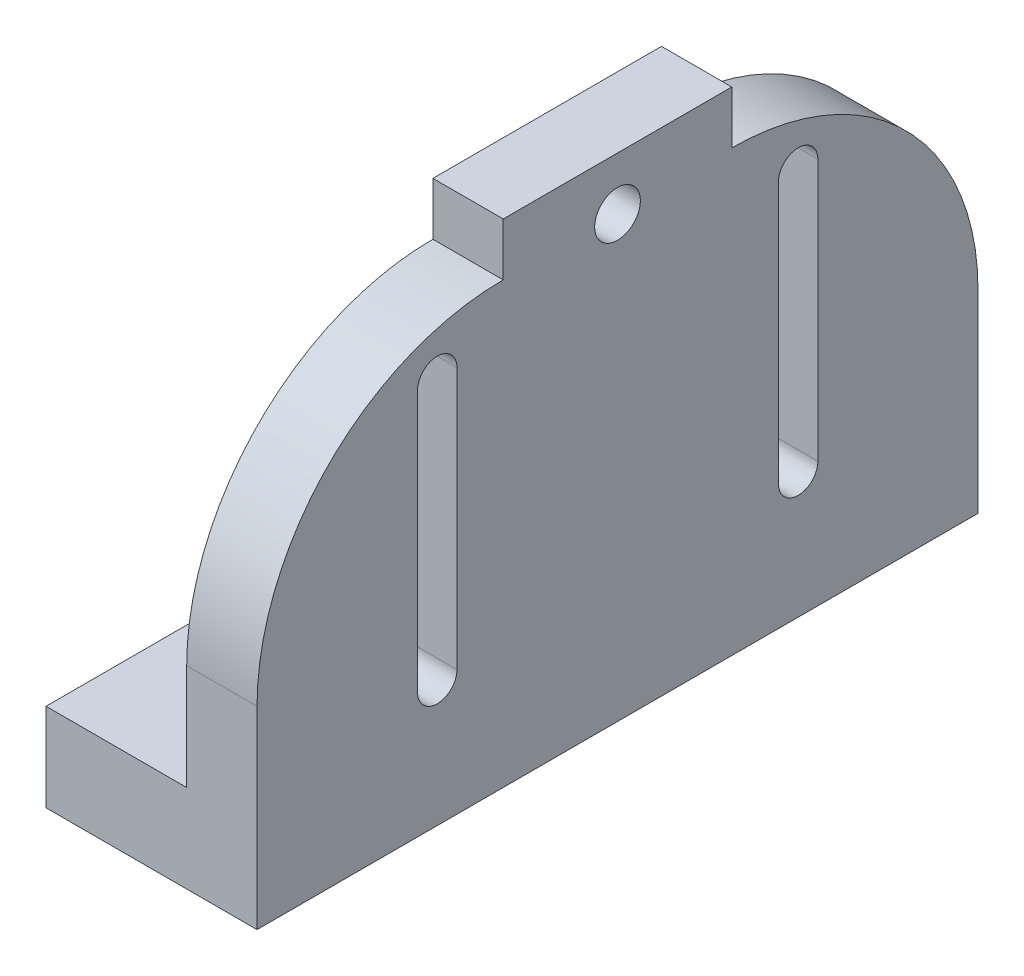
ISO-10303-21;
HEADER;
FILE_DESCRIPTION(('STEP AP214'),'2;1');
FILE_NAME('part.step','',(''),(''),'','','');
FILE_SCHEMA(('AUTOMOTIVE_DESIGN { 1 0 10303 214 1 1 1 1 }'));
ENDSEC;
DATA;
#1=APPLICATION_CONTEXT('core data for automotive mechanical design processes');
#2=APPLICATION_PROTOCOL_DEFINITION('international standard','automotive_design',2000,#1);
#3=PRODUCT_CONTEXT('',#1,'mechanical');
#4=PRODUCT('Part','Part','',(#3));
#5=PRODUCT_RELATED_PRODUCT_CATEGORY('part','',(#4));
#6=PRODUCT_DEFINITION_FORMATION('','',#4);
#7=PRODUCT_DEFINITION_CONTEXT('part definition',#1,'design');
#8=PRODUCT_DEFINITION('design','',#6,#7);
#9=PRODUCT_DEFINITION_SHAPE('','',#8);
#10=(LENGTH_UNIT() NAMED_UNIT(*) SI_UNIT(.MILLI.,.METRE.));
#11=(NAMED_UNIT(*) PLANE_ANGLE_UNIT() SI_UNIT($,.RADIAN.));
#12=(NAMED_UNIT(*) SI_UNIT($,.STERADIAN.) SOLID_ANGLE_UNIT());
#13=UNCERTAINTY_MEASURE_WITH_UNIT(LENGTH_MEASURE(1.E-05),#10,'distance_accuracy_value','');
#14=(GEOMETRIC_REPRESENTATION_CONTEXT(3) GLOBAL_UNCERTAINTY_ASSIGNED_CONTEXT((#13)) GLOBAL_UNIT_ASSIGNED_CONTEXT((#10,
#11,#12)) REPRESENTATION_CONTEXT('',''));
#15=CARTESIAN_POINT('',(0.,0.,0.));
#16=DIRECTION('',(0.,0.,1.));
#17=DIRECTION('',(1.,0.,0.));
#18=AXIS2_PLACEMENT_3D('',#15,#16,#17);
#19=CARTESIAN_POINT('',(0.,6.35,0.));
#20=DIRECTION('',(0.,-1.,0.));
#21=DIRECTION('',(0.,0.,-1.));
#22=AXIS2_PLACEMENT_3D('',#19,#20,#21);
#23=PLANE('',#22);
#24=CARTESIAN_POINT('',(5.08,6.35,-38.735));
#25=DIRECTION('',(0.,1.,0.));
#26=DIRECTION('',(0.,0.,1.));
#27=AXIS2_PLACEMENT_3D('',#24,#25,#26);
#28=CIRCLE('',#27,1.651);
#29=CARTESIAN_POINT('',(5.08,6.35,-37.084));
#30=VERTEX_POINT('',#29);
#31=EDGE_CURVE('E201',#30,#30,#28,.T.);
#32=ORIENTED_EDGE('',*,*,#31,.F.);
#33=EDGE_LOOP('',(#32));
#34=FACE_BOUND('',#33,.T.);
#35=CARTESIAN_POINT('',(5.08,6.35,-13.335));
#36=DIRECTION('',(0.,1.,0.));
#37=DIRECTION('',(0.,0.,1.));
#38=AXIS2_PLACEMENT_3D('',#35,#36,#37);
#39=CIRCLE('',#38,1.651);
#40=CARTESIAN_POINT('',(5.08,6.35,-11.684));
#41=VERTEX_POINT('',#40);
#42=EDGE_CURVE('E198',#41,#41,#39,.T.);
#43=ORIENTED_EDGE('',*,*,#42,.F.);
#44=EDGE_LOOP('',(#43));
#45=FACE_BOUND('',#44,.T.);
#46=DIRECTION('',(0.,0.,1.));
#47=VECTOR('',#46,1.);
#48=CARTESIAN_POINT('',(10.16,6.35,-52.07));
#49=LINE('',#48,#47);
#50=CARTESIAN_POINT('',(10.16,6.35,-52.07));
#51=VERTEX_POINT('',#50);
#52=CARTESIAN_POINT('',(10.16,6.35,0.));
#53=VERTEX_POINT('',#52);
#54=EDGE_CURVE('E225',#51,#53,#49,.T.);
#55=ORIENTED_EDGE('',*,*,#54,.F.);
#56=DIRECTION('',(-1.,0.,0.));
#57=VECTOR('',#56,1.);
#58=CARTESIAN_POINT('',(0.,6.35,-52.07));
#59=LINE('',#58,#57);
#60=CARTESIAN_POINT('',(0.,6.35,-52.07));
#61=VERTEX_POINT('',#60);
#62=EDGE_CURVE('E266',#51,#61,#59,.T.);
#63=ORIENTED_EDGE('',*,*,#62,.T.);
#64=DIRECTION('',(0.,0.,1.));
#65=VECTOR('',#64,1.);
#66=CARTESIAN_POINT('',(0.,6.35,0.));
#67=LINE('',#66,#65);
#68=CARTESIAN_POINT('',(0.,6.35,0.));
#69=VERTEX_POINT('',#68);
#70=EDGE_CURVE('E259',#61,#69,#67,.T.);
#71=ORIENTED_EDGE('',*,*,#70,.T.);
#72=DIRECTION('',(1.,0.,0.));
#73=VECTOR('',#72,1.);
#74=CARTESIAN_POINT('',(0.,6.35,0.));
#75=LINE('',#74,#73);
#76=EDGE_CURVE('E262',#69,#53,#75,.T.);
#77=ORIENTED_EDGE('',*,*,#76,.T.);
#78=EDGE_LOOP('',(#55,#63,#71,#77));
#79=FACE_BOUND('',#78,.T.);
#80=ADVANCED_FACE('F47',(#34,#45,#79),#23,.F.);
#81=CARTESIAN_POINT('',(0.,6.35,0.));
#82=DIRECTION('',(1.,0.,0.));
#83=DIRECTION('',(0.,0.,-1.));
#84=AXIS2_PLACEMENT_3D('',#81,#82,#83);
#85=PLANE('',#84);
#86=DIRECTION('',(0.,0.,1.));
#87=VECTOR('',#86,1.);
#88=CARTESIAN_POINT('',(0.,0.,0.));
#89=LINE('',#88,#87);
#90=CARTESIAN_POINT('',(0.,0.,-52.07));
#91=VERTEX_POINT('',#90);
#92=CARTESIAN_POINT('',(0.,0.,0.));
#93=VERTEX_POINT('',#92);
#94=EDGE_CURVE('E258',#91,#93,#89,.T.);
#95=ORIENTED_EDGE('',*,*,#94,.T.);
#96=DIRECTION('',(0.,-1.,0.));
#97=VECTOR('',#96,1.);
#98=CARTESIAN_POINT('',(0.,6.35,0.));
#99=LINE('',#98,#97);
#100=EDGE_CURVE('E284',#69,#93,#99,.T.);
#101=ORIENTED_EDGE('',*,*,#100,.F.);
#102=ORIENTED_EDGE('',*,*,#70,.F.);
#103=DIRECTION('',(0.,-1.,0.));
#104=VECTOR('',#103,1.);
#105=CARTESIAN_POINT('',(0.,6.35,-52.07));
#106=LINE('',#105,#104);
#107=EDGE_CURVE('E268',#61,#91,#106,.T.);
#108=ORIENTED_EDGE('',*,*,#107,.T.);
#109=EDGE_LOOP('',(#95,#101,#102,#108));
#110=FACE_BOUND('',#109,.T.);
#111=ADVANCED_FACE('F382',(#110),#85,.F.);
#112=CARTESIAN_POINT('',(0.,6.35,0.));
#113=DIRECTION('',(0.,0.,-1.));
#114=DIRECTION('',(-1.,0.,0.));
#115=AXIS2_PLACEMENT_3D('',#112,#113,#114);
#116=PLANE('',#115);
#117=DIRECTION('',(0.,-1.,0.));
#118=VECTOR('',#117,1.);
#119=CARTESIAN_POINT('',(15.24,6.35,0.));
#120=LINE('',#119,#118);
#121=CARTESIAN_POINT('',(15.24,13.97,0.));
#122=VERTEX_POINT('',#121);
#123=CARTESIAN_POINT('',(15.24,0.,0.));
#124=VERTEX_POINT('',#123);
#125=EDGE_CURVE('E282',#122,#124,#120,.T.);
#126=ORIENTED_EDGE('',*,*,#125,.F.);
#127=DIRECTION('',(1.,0.,0.));
#128=VECTOR('',#127,1.);
#129=CARTESIAN_POINT('',(0.,13.97,0.));
#130=LINE('',#129,#128);
#131=CARTESIAN_POINT('',(10.16,13.97,0.));
#132=VERTEX_POINT('',#131);
#133=EDGE_CURVE('E70',#122,#132,#130,.F.);
#134=ORIENTED_EDGE('',*,*,#133,.T.);
#135=DIRECTION('',(0.,-1.,0.));
#136=VECTOR('',#135,1.);
#137=CARTESIAN_POINT('',(10.16,31.75,0.));
#138=LINE('',#137,#136);
#139=EDGE_CURVE('E254',#132,#53,#138,.T.);
#140=ORIENTED_EDGE('',*,*,#139,.T.);
#141=ORIENTED_EDGE('',*,*,#76,.F.);
#142=ORIENTED_EDGE('',*,*,#100,.T.);
#143=DIRECTION('',(1.,0.,0.));
#144=VECTOR('',#143,1.);
#145=CARTESIAN_POINT('',(0.,0.,0.));
#146=LINE('',#145,#144);
#147=EDGE_CURVE('E271',#93,#124,#146,.T.);
#148=ORIENTED_EDGE('',*,*,#147,.T.);
#149=EDGE_LOOP('',(#126,#134,#140,#141,#142,#148));
#150=FACE_BOUND('',#149,.T.);
#151=ADVANCED_FACE('F390',(#150),#116,.F.);
#152=CARTESIAN_POINT('',(15.24,6.35,0.));
#153=DIRECTION('',(-1.,0.,0.));
#154=DIRECTION('',(0.,0.,1.));
#155=AXIS2_PLACEMENT_3D('',#152,#153,#154);
#156=PLANE('',#155);
#157=CARTESIAN_POINT('',(15.24,31.75,-26.035));
#158=DIRECTION('',(-1.,0.,0.));
#159=DIRECTION('',(0.,0.,1.));
#160=AXIS2_PLACEMENT_3D('',#157,#158,#159);
#161=CIRCLE('',#160,1.651);
#162=CARTESIAN_POINT('',(15.24,31.75,-24.384));
#163=VERTEX_POINT('',#162);
#164=EDGE_CURVE('E191',#163,#163,#161,.T.);
#165=ORIENTED_EDGE('',*,*,#164,.T.);
#166=EDGE_LOOP('',(#165));
#167=FACE_BOUND('',#166,.T.);
#168=DIRECTION('',(0.,-1.,0.));
#169=VECTOR('',#168,1.);
#170=CARTESIAN_POINT('',(15.24,27.94,-11.5951));
#171=LINE('',#170,#169);
#172=CARTESIAN_POINT('',(15.24,27.94,-11.5951));
#173=VERTEX_POINT('',#172);
#174=CARTESIAN_POINT('',(15.24,9.0424,-11.5951));
#175=VERTEX_POINT('',#174);
#176=EDGE_CURVE('E212',#173,#175,#171,.T.);
#177=ORIENTED_EDGE('',*,*,#176,.F.);
#178=CARTESIAN_POINT('',(15.24,27.94,-13.0175));
#179=DIRECTION('',(1.,0.,0.));
#180=DIRECTION('',(0.,0.,-1.));
#181=AXIS2_PLACEMENT_3D('',#178,#179,#180);
#182=CIRCLE('',#181,1.42239999999999);
#183=CARTESIAN_POINT('',(15.24,27.94,-14.4399));
#184=VERTEX_POINT('',#183);
#185=EDGE_CURVE('E210',#184,#173,#182,.T.);
#186=ORIENTED_EDGE('',*,*,#185,.F.);
#187=DIRECTION('',(0.,1.,0.));
#188=VECTOR('',#187,1.);
#189=CARTESIAN_POINT('',(15.24,27.94,-14.4399));
#190=LINE('',#189,#188);
#191=CARTESIAN_POINT('',(15.24,9.0424,-14.4399));
#192=VERTEX_POINT('',#191);
#193=EDGE_CURVE('E219',#192,#184,#190,.T.);
#194=ORIENTED_EDGE('',*,*,#193,.F.);
#195=CARTESIAN_POINT('',(15.24,9.0424,-13.0175));
#196=DIRECTION('',(1.,0.,0.));
#197=DIRECTION('',(0.,0.,-1.));
#198=AXIS2_PLACEMENT_3D('',#195,#196,#197);
#199=CIRCLE('',#198,1.4224);
#200=EDGE_CURVE('E216',#175,#192,#199,.T.);
#201=ORIENTED_EDGE('',*,*,#200,.F.);
#202=EDGE_LOOP('',(#177,#186,#194,#201));
#203=FACE_BOUND('',#202,.T.);
#204=DIRECTION('',(0.,-1.,0.));
#205=VECTOR('',#204,1.);
#206=CARTESIAN_POINT('',(15.24,27.94,-37.6604262696524));
#207=LINE('',#206,#205);
#208=CARTESIAN_POINT('',(15.24,27.94,-37.6604262696524));
#209=VERTEX_POINT('',#208);
#210=CARTESIAN_POINT('',(15.24,9.0424,-37.6604262696524));
#211=VERTEX_POINT('',#210);
#212=EDGE_CURVE('E248',#209,#211,#207,.T.);
#213=ORIENTED_EDGE('',*,*,#212,.F.);
#214=CARTESIAN_POINT('',(15.24,27.94,-39.0828262696524));
#215=DIRECTION('',(1.,0.,0.));
#216=DIRECTION('',(0.,0.,-1.));
#217=AXIS2_PLACEMENT_3D('',#214,#215,#216);
#218=CIRCLE('',#217,1.42239999999999);
#219=CARTESIAN_POINT('',(15.24,27.94,-40.5052262696524));
#220=VERTEX_POINT('',#219);
#221=EDGE_CURVE('E213',#220,#209,#218,.T.);
#222=ORIENTED_EDGE('',*,*,#221,.F.);
#223=DIRECTION('',(0.,1.,0.));
#224=VECTOR('',#223,1.);
#225=CARTESIAN_POINT('',(15.24,27.94,-40.5052262696524));
#226=LINE('',#225,#224);
#227=CARTESIAN_POINT('',(15.24,9.0424,-40.5052262696524));
#228=VERTEX_POINT('',#227);
#229=EDGE_CURVE('E235',#228,#220,#226,.T.);
#230=ORIENTED_EDGE('',*,*,#229,.F.);
#231=CARTESIAN_POINT('',(15.24,9.0424,-39.0828262696524));
#232=DIRECTION('',(1.,0.,0.));
#233=DIRECTION('',(0.,0.,-1.));
#234=AXIS2_PLACEMENT_3D('',#231,#232,#233);
#235=CIRCLE('',#234,1.42239999999999);
#236=EDGE_CURVE('E245',#211,#228,#235,.T.);
#237=ORIENTED_EDGE('',*,*,#236,.F.);
#238=EDGE_LOOP('',(#213,#222,#230,#237));
#239=FACE_BOUND('',#238,.T.);
#240=CARTESIAN_POINT('',(15.24,13.97,-34.29));
#241=DIRECTION('',(-1.,0.,0.));
#242=DIRECTION('',(0.,0.,1.));
#243=AXIS2_PLACEMENT_3D('',#240,#241,#242);
#244=CIRCLE('',#243,17.78);
#245=CARTESIAN_POINT('',(15.24,13.97,-52.07));
#246=VERTEX_POINT('',#245);
#247=CARTESIAN_POINT('',(15.24,31.75,-34.29));
#248=VERTEX_POINT('',#247);
#249=EDGE_CURVE('E196',#246,#248,#244,.F.);
#250=ORIENTED_EDGE('',*,*,#249,.T.);
#251=DIRECTION('',(0.,-1.,0.));
#252=VECTOR('',#251,1.);
#253=CARTESIAN_POINT('',(15.24,35.56,-34.29));
#254=LINE('',#253,#252);
#255=CARTESIAN_POINT('',(15.24,35.56,-34.29));
#256=VERTEX_POINT('',#255);
#257=EDGE_CURVE('E177',#256,#248,#254,.T.);
#258=ORIENTED_EDGE('',*,*,#257,.F.);
#259=DIRECTION('',(0.,0.,-1.));
#260=VECTOR('',#259,1.);
#261=CARTESIAN_POINT('',(15.24,35.56,-34.29));
#262=LINE('',#261,#260);
#263=CARTESIAN_POINT('',(15.24,35.56,-17.78));
#264=VERTEX_POINT('',#263);
#265=EDGE_CURVE('E182',#264,#256,#262,.T.);
#266=ORIENTED_EDGE('',*,*,#265,.F.);
#267=DIRECTION('',(0.,-1.,0.));
#268=VECTOR('',#267,1.);
#269=CARTESIAN_POINT('',(15.24,35.56,-17.78));
#270=LINE('',#269,#268);
#271=CARTESIAN_POINT('',(15.24,31.75,-17.78));
#272=VERTEX_POINT('',#271);
#273=EDGE_CURVE('E333',#264,#272,#270,.T.);
#274=ORIENTED_EDGE('',*,*,#273,.T.);
#275=CARTESIAN_POINT('',(15.24,13.97,-17.78));
#276=DIRECTION('',(-1.,0.,0.));
#277=DIRECTION('',(0.,0.,1.));
#278=AXIS2_PLACEMENT_3D('',#275,#276,#277);
#279=CIRCLE('',#278,17.78);
#280=EDGE_CURVE('E321',#272,#122,#279,.F.);
#281=ORIENTED_EDGE('',*,*,#280,.T.);
#282=ORIENTED_EDGE('',*,*,#125,.T.);
#283=DIRECTION('',(0.,0.,-1.));
#284=VECTOR('',#283,1.);
#285=CARTESIAN_POINT('',(15.24,0.,0.));
#286=LINE('',#285,#284);
#287=CARTESIAN_POINT('',(15.24,0.,-52.07));
#288=VERTEX_POINT('',#287);
#289=EDGE_CURVE('E274',#124,#288,#286,.T.);
#290=ORIENTED_EDGE('',*,*,#289,.T.);
#291=DIRECTION('',(0.,-1.,0.));
#292=VECTOR('',#291,1.);
#293=CARTESIAN_POINT('',(15.24,6.35,-52.07));
#294=LINE('',#293,#292);
#295=EDGE_CURVE('E280',#246,#288,#294,.T.);
#296=ORIENTED_EDGE('',*,*,#295,.F.);
#297=EDGE_LOOP('',(#250,#258,#266,#274,#281,#282,#290,#296));
#298=FACE_BOUND('',#297,.T.);
#299=ADVANCED_FACE('F193',(#167,#203,#239,#298),#156,.F.);
#300=CARTESIAN_POINT('',(0.,6.35,-52.07));
#301=DIRECTION('',(0.,0.,1.));
#302=DIRECTION('',(1.,0.,0.));
#303=AXIS2_PLACEMENT_3D('',#300,#301,#302);
#304=PLANE('',#303);
#305=DIRECTION('',(0.,-1.,0.));
#306=VECTOR('',#305,1.);
#307=CARTESIAN_POINT('',(10.16,31.75,-52.07));
#308=LINE('',#307,#306);
#309=CARTESIAN_POINT('',(10.16,13.97,-52.07));
#310=VERTEX_POINT('',#309);
#311=EDGE_CURVE('E256',#310,#51,#308,.T.);
#312=ORIENTED_EDGE('',*,*,#311,.F.);
#313=DIRECTION('',(-1.,0.,0.));
#314=VECTOR('',#313,1.);
#315=CARTESIAN_POINT('',(0.,13.97,-52.07));
#316=LINE('',#315,#314);
#317=EDGE_CURVE('E11',#310,#246,#316,.F.);
#318=ORIENTED_EDGE('',*,*,#317,.T.);
#319=ORIENTED_EDGE('',*,*,#295,.T.);
#320=DIRECTION('',(-1.,0.,0.));
#321=VECTOR('',#320,1.);
#322=CARTESIAN_POINT('',(0.,0.,-52.07));
#323=LINE('',#322,#321);
#324=EDGE_CURVE('E263',#288,#91,#323,.T.);
#325=ORIENTED_EDGE('',*,*,#324,.T.);
#326=ORIENTED_EDGE('',*,*,#107,.F.);
#327=ORIENTED_EDGE('',*,*,#62,.F.);
#328=EDGE_LOOP('',(#312,#318,#319,#325,#326,#327));
#329=FACE_BOUND('',#328,.T.);
#330=ADVANCED_FACE('F398',(#329),#304,.F.);
#331=CARTESIAN_POINT('',(0.,0.,0.));
#332=DIRECTION('',(0.,-1.,0.));
#333=DIRECTION('',(0.,0.,-1.));
#334=AXIS2_PLACEMENT_3D('',#331,#332,#333);
#335=PLANE('',#334);
#336=CARTESIAN_POINT('',(5.08,0.,-38.735));
#337=DIRECTION('',(0.,-1.,0.));
#338=DIRECTION('',(0.,0.,-1.));
#339=AXIS2_PLACEMENT_3D('',#336,#337,#338);
#340=CIRCLE('',#339,1.651);
#341=CARTESIAN_POINT('',(5.08,0.,-40.386));
#342=VERTEX_POINT('',#341);
#343=EDGE_CURVE('E242',#342,#342,#340,.T.);
#344=ORIENTED_EDGE('',*,*,#343,.F.);
#345=EDGE_LOOP('',(#344));
#346=FACE_BOUND('',#345,.T.);
#347=CARTESIAN_POINT('',(5.08,0.,-13.335));
#348=DIRECTION('',(0.,-1.,0.));
#349=DIRECTION('',(0.,0.,-1.));
#350=AXIS2_PLACEMENT_3D('',#347,#348,#349);
#351=CIRCLE('',#350,1.651);
#352=CARTESIAN_POINT('',(5.08,0.,-14.986));
#353=VERTEX_POINT('',#352);
#354=EDGE_CURVE('E208',#353,#353,#351,.T.);
#355=ORIENTED_EDGE('',*,*,#354,.F.);
#356=EDGE_LOOP('',(#355));
#357=FACE_BOUND('',#356,.T.);
#358=ORIENTED_EDGE('',*,*,#94,.F.);
#359=ORIENTED_EDGE('',*,*,#324,.F.);
#360=ORIENTED_EDGE('',*,*,#289,.F.);
#361=ORIENTED_EDGE('',*,*,#147,.F.);
#362=EDGE_LOOP('',(#358,#359,#360,#361));
#363=FACE_BOUND('',#362,.T.);
#364=ADVANCED_FACE('F350',(#346,#357,#363),#335,.T.);
#365=CARTESIAN_POINT('',(10.16,31.75,-52.07));
#366=DIRECTION('',(1.,0.,0.));
#367=DIRECTION('',(0.,0.,-1.));
#368=AXIS2_PLACEMENT_3D('',#365,#366,#367);
#369=PLANE('',#368);
#370=CARTESIAN_POINT('',(10.16,31.75,-26.035));
#371=DIRECTION('',(-1.,0.,0.));
#372=DIRECTION('',(0.,0.,1.));
#373=AXIS2_PLACEMENT_3D('',#370,#371,#372);
#374=CIRCLE('',#373,1.651);
#375=CARTESIAN_POINT('',(10.16,31.75,-24.384));
#376=VERTEX_POINT('',#375);
#377=EDGE_CURVE('E340',#376,#376,#374,.T.);
#378=ORIENTED_EDGE('',*,*,#377,.F.);
#379=EDGE_LOOP('',(#378));
#380=FACE_BOUND('',#379,.T.);
#381=DIRECTION('',(0.,1.,0.));
#382=VECTOR('',#381,1.);
#383=CARTESIAN_POINT('',(10.16,31.75,-14.4399));
#384=LINE('',#383,#382);
#385=CARTESIAN_POINT('',(10.16,9.0424,-14.4399));
#386=VERTEX_POINT('',#385);
#387=CARTESIAN_POINT('',(10.16,27.94,-14.4399));
#388=VERTEX_POINT('',#387);
#389=EDGE_CURVE('E305',#386,#388,#384,.T.);
#390=ORIENTED_EDGE('',*,*,#389,.T.);
#391=CARTESIAN_POINT('',(10.16,27.94,-13.0175));
#392=DIRECTION('',(1.,0.,0.));
#393=DIRECTION('',(0.,0.,-1.));
#394=AXIS2_PLACEMENT_3D('',#391,#392,#393);
#395=CIRCLE('',#394,1.42239999999999);
#396=CARTESIAN_POINT('',(10.16,27.94,-11.5951));
#397=VERTEX_POINT('',#396);
#398=EDGE_CURVE('E308',#388,#397,#395,.T.);
#399=ORIENTED_EDGE('',*,*,#398,.T.);
#400=DIRECTION('',(0.,-1.,0.));
#401=VECTOR('',#400,1.);
#402=CARTESIAN_POINT('',(10.16,31.75,-11.5951));
#403=LINE('',#402,#401);
#404=CARTESIAN_POINT('',(10.16,9.0424,-11.5951));
#405=VERTEX_POINT('',#404);
#406=EDGE_CURVE('E299',#397,#405,#403,.T.);
#407=ORIENTED_EDGE('',*,*,#406,.T.);
#408=CARTESIAN_POINT('',(10.16,9.0424,-13.0175));
#409=DIRECTION('',(1.,0.,0.));
#410=DIRECTION('',(0.,0.,-1.));
#411=AXIS2_PLACEMENT_3D('',#408,#409,#410);
#412=CIRCLE('',#411,1.4224);
#413=EDGE_CURVE('E302',#405,#386,#412,.T.);
#414=ORIENTED_EDGE('',*,*,#413,.T.);
#415=EDGE_LOOP('',(#390,#399,#407,#414));
#416=FACE_BOUND('',#415,.T.);
#417=DIRECTION('',(0.,1.,0.));
#418=VECTOR('',#417,1.);
#419=CARTESIAN_POINT('',(10.16,31.75,-40.5052262696524));
#420=LINE('',#419,#418);
#421=CARTESIAN_POINT('',(10.16,9.0424,-40.5052262696524));
#422=VERTEX_POINT('',#421);
#423=CARTESIAN_POINT('',(10.16,27.94,-40.5052262696524));
#424=VERTEX_POINT('',#423);
#425=EDGE_CURVE('E293',#422,#424,#420,.T.);
#426=ORIENTED_EDGE('',*,*,#425,.T.);
#427=CARTESIAN_POINT('',(10.16,27.94,-39.0828262696524));
#428=DIRECTION('',(1.,0.,0.));
#429=DIRECTION('',(0.,0.,-1.));
#430=AXIS2_PLACEMENT_3D('',#427,#428,#429);
#431=CIRCLE('',#430,1.42239999999999);
#432=CARTESIAN_POINT('',(10.16,27.94,-37.6604262696524));
#433=VERTEX_POINT('',#432);
#434=EDGE_CURVE('E296',#424,#433,#431,.T.);
#435=ORIENTED_EDGE('',*,*,#434,.T.);
#436=DIRECTION('',(0.,-1.,0.));
#437=VECTOR('',#436,1.);
#438=CARTESIAN_POINT('',(10.16,31.75,-37.6604262696524));
#439=LINE('',#438,#437);
#440=CARTESIAN_POINT('',(10.16,9.04240000000001,-37.6604262696524));
#441=VERTEX_POINT('',#440);
#442=EDGE_CURVE('E287',#433,#441,#439,.T.);
#443=ORIENTED_EDGE('',*,*,#442,.T.);
#444=CARTESIAN_POINT('',(10.16,9.0424,-39.0828262696524));
#445=DIRECTION('',(1.,0.,0.));
#446=DIRECTION('',(0.,0.,-1.));
#447=AXIS2_PLACEMENT_3D('',#444,#445,#446);
#448=CIRCLE('',#447,1.42239999999999);
#449=EDGE_CURVE('E290',#441,#422,#448,.T.);
#450=ORIENTED_EDGE('',*,*,#449,.T.);
#451=EDGE_LOOP('',(#426,#435,#443,#450));
#452=FACE_BOUND('',#451,.T.);
#453=ORIENTED_EDGE('',*,*,#139,.F.);
#454=CARTESIAN_POINT('',(10.16,13.97,-17.78));
#455=DIRECTION('',(1.,0.,0.));
#456=DIRECTION('',(0.,0.,-1.));
#457=AXIS2_PLACEMENT_3D('',#454,#455,#456);
#458=CIRCLE('',#457,17.78);
#459=CARTESIAN_POINT('',(10.16,31.75,-17.78));
#460=VERTEX_POINT('',#459);
#461=EDGE_CURVE('E55',#132,#460,#458,.F.);
#462=ORIENTED_EDGE('',*,*,#461,.T.);
#463=DIRECTION('',(0.,-1.,0.));
#464=VECTOR('',#463,1.);
#465=CARTESIAN_POINT('',(10.16,35.56,-17.78));
#466=LINE('',#465,#464);
#467=CARTESIAN_POINT('',(10.16,35.56,-17.78));
#468=VERTEX_POINT('',#467);
#469=EDGE_CURVE('E203',#468,#460,#466,.T.);
#470=ORIENTED_EDGE('',*,*,#469,.F.);
#471=DIRECTION('',(0.,0.,1.));
#472=VECTOR('',#471,1.);
#473=CARTESIAN_POINT('',(10.16,35.56,-34.29));
#474=LINE('',#473,#472);
#475=CARTESIAN_POINT('',(10.16,35.56,-34.29));
#476=VERTEX_POINT('',#475);
#477=EDGE_CURVE('E181',#476,#468,#474,.T.);
#478=ORIENTED_EDGE('',*,*,#477,.F.);
#479=DIRECTION('',(0.,-1.,0.));
#480=VECTOR('',#479,1.);
#481=CARTESIAN_POINT('',(10.16,35.56,-34.29));
#482=LINE('',#481,#480);
#483=CARTESIAN_POINT('',(10.16,31.75,-34.29));
#484=VERTEX_POINT('',#483);
#485=EDGE_CURVE('E178',#476,#484,#482,.T.);
#486=ORIENTED_EDGE('',*,*,#485,.T.);
#487=CARTESIAN_POINT('',(10.16,13.97,-34.29));
#488=DIRECTION('',(1.,0.,0.));
#489=DIRECTION('',(0.,0.,-1.));
#490=AXIS2_PLACEMENT_3D('',#487,#488,#489);
#491=CIRCLE('',#490,17.78);
#492=EDGE_CURVE('E62',#484,#310,#491,.F.);
#493=ORIENTED_EDGE('',*,*,#492,.T.);
#494=ORIENTED_EDGE('',*,*,#311,.T.);
#495=ORIENTED_EDGE('',*,*,#54,.T.);
#496=EDGE_LOOP('',(#453,#462,#470,#478,#486,#493,#494,#495));
#497=FACE_BOUND('',#496,.T.);
#498=ADVANCED_FACE('F327',(#380,#416,#452,#497),#369,.F.);
#499=CARTESIAN_POINT('',(6.858,27.94,-39.0828262696524));
#500=DIRECTION('',(1.,0.,0.));
#501=DIRECTION('',(0.,0.,-1.));
#502=AXIS2_PLACEMENT_3D('',#499,#500,#501);
#503=CYLINDRICAL_SURFACE('',#502,1.42239999999999);
#504=DIRECTION('',(1.,0.,0.));
#505=VECTOR('',#504,1.);
#506=CARTESIAN_POINT('',(6.858,27.94,-40.5052262696524));
#507=LINE('',#506,#505);
#508=EDGE_CURVE('E240',#424,#220,#507,.T.);
#509=ORIENTED_EDGE('',*,*,#508,.T.);
#510=ORIENTED_EDGE('',*,*,#221,.T.);
#511=DIRECTION('',(1.,0.,0.));
#512=VECTOR('',#511,1.);
#513=CARTESIAN_POINT('',(6.858,27.94,-37.6604262696524));
#514=LINE('',#513,#512);
#515=EDGE_CURVE('E232',#433,#209,#514,.T.);
#516=ORIENTED_EDGE('',*,*,#515,.F.);
#517=ORIENTED_EDGE('',*,*,#434,.F.);
#518=EDGE_LOOP('',(#509,#510,#516,#517));
#519=FACE_BOUND('',#518,.T.);
#520=ADVANCED_FACE('F349',(#519),#503,.F.);
#521=CARTESIAN_POINT('',(6.858,27.94,-40.5052262696524));
#522=DIRECTION('',(0.,0.,-1.));
#523=DIRECTION('',(0.,1.,0.));
#524=AXIS2_PLACEMENT_3D('',#521,#522,#523);
#525=PLANE('',#524);
#526=DIRECTION('',(1.,0.,0.));
#527=VECTOR('',#526,1.);
#528=CARTESIAN_POINT('',(6.858,9.0424,-40.5052262696524));
#529=LINE('',#528,#527);
#530=EDGE_CURVE('E238',#422,#228,#529,.T.);
#531=ORIENTED_EDGE('',*,*,#530,.T.);
#532=ORIENTED_EDGE('',*,*,#229,.T.);
#533=ORIENTED_EDGE('',*,*,#508,.F.);
#534=ORIENTED_EDGE('',*,*,#425,.F.);
#535=EDGE_LOOP('',(#531,#532,#533,#534));
#536=FACE_BOUND('',#535,.T.);
#537=ADVANCED_FACE('F357',(#536),#525,.F.);
#538=CARTESIAN_POINT('',(6.858,9.0424,-39.0828262696524));
#539=DIRECTION('',(1.,0.,0.));
#540=DIRECTION('',(0.,0.,-1.));
#541=AXIS2_PLACEMENT_3D('',#538,#539,#540);
#542=CYLINDRICAL_SURFACE('',#541,1.42239999999999);
#543=DIRECTION('',(1.,0.,0.));
#544=VECTOR('',#543,1.);
#545=CARTESIAN_POINT('',(6.858,9.0424,-37.6604262696524));
#546=LINE('',#545,#544);
#547=EDGE_CURVE('E236',#441,#211,#546,.T.);
#548=ORIENTED_EDGE('',*,*,#547,.T.);
#549=ORIENTED_EDGE('',*,*,#236,.T.);
#550=ORIENTED_EDGE('',*,*,#530,.F.);
#551=ORIENTED_EDGE('',*,*,#449,.F.);
#552=EDGE_LOOP('',(#548,#549,#550,#551));
#553=FACE_BOUND('',#552,.T.);
#554=ADVANCED_FACE('F359',(#553),#542,.F.);
#555=CARTESIAN_POINT('',(6.858,27.94,-37.6604262696524));
#556=DIRECTION('',(0.,0.,1.));
#557=DIRECTION('',(0.,-1.,0.));
#558=AXIS2_PLACEMENT_3D('',#555,#556,#557);
#559=PLANE('',#558);
#560=ORIENTED_EDGE('',*,*,#515,.T.);
#561=ORIENTED_EDGE('',*,*,#212,.T.);
#562=ORIENTED_EDGE('',*,*,#547,.F.);
#563=ORIENTED_EDGE('',*,*,#442,.F.);
#564=EDGE_LOOP('',(#560,#561,#562,#563));
#565=FACE_BOUND('',#564,.T.);
#566=ADVANCED_FACE('F368',(#565),#559,.F.);
#567=CARTESIAN_POINT('',(6.858,27.94,-13.0175));
#568=DIRECTION('',(1.,0.,0.));
#569=DIRECTION('',(0.,0.,-1.));
#570=AXIS2_PLACEMENT_3D('',#567,#568,#569);
#571=CYLINDRICAL_SURFACE('',#570,1.42239999999999);
#572=DIRECTION('',(1.,0.,0.));
#573=VECTOR('',#572,1.);
#574=CARTESIAN_POINT('',(6.858,27.94,-14.4399));
#575=LINE('',#574,#573);
#576=EDGE_CURVE('E223',#388,#184,#575,.T.);
#577=ORIENTED_EDGE('',*,*,#576,.T.);
#578=ORIENTED_EDGE('',*,*,#185,.T.);
#579=DIRECTION('',(1.,0.,0.));
#580=VECTOR('',#579,1.);
#581=CARTESIAN_POINT('',(6.858,27.94,-11.5951));
#582=LINE('',#581,#580);
#583=EDGE_CURVE('E222',#397,#173,#582,.T.);
#584=ORIENTED_EDGE('',*,*,#583,.F.);
#585=ORIENTED_EDGE('',*,*,#398,.F.);
#586=EDGE_LOOP('',(#577,#578,#584,#585));
#587=FACE_BOUND('',#586,.T.);
#588=ADVANCED_FACE('F370',(#587),#571,.F.);
#589=CARTESIAN_POINT('',(6.858,27.94,-14.4399));
#590=DIRECTION('',(0.,0.,-1.));
#591=DIRECTION('',(0.,1.,0.));
#592=AXIS2_PLACEMENT_3D('',#589,#590,#591);
#593=PLANE('',#592);
#594=DIRECTION('',(1.,0.,0.));
#595=VECTOR('',#594,1.);
#596=CARTESIAN_POINT('',(6.858,9.0424,-14.4399));
#597=LINE('',#596,#595);
#598=EDGE_CURVE('E226',#386,#192,#597,.T.);
#599=ORIENTED_EDGE('',*,*,#598,.T.);
#600=ORIENTED_EDGE('',*,*,#193,.T.);
#601=ORIENTED_EDGE('',*,*,#576,.F.);
#602=ORIENTED_EDGE('',*,*,#389,.F.);
#603=EDGE_LOOP('',(#599,#600,#601,#602));
#604=FACE_BOUND('',#603,.T.);
#605=ADVANCED_FACE('F376',(#604),#593,.F.);
#606=CARTESIAN_POINT('',(6.858,9.0424,-13.0175));
#607=DIRECTION('',(1.,0.,0.));
#608=DIRECTION('',(0.,0.,-1.));
#609=AXIS2_PLACEMENT_3D('',#606,#607,#608);
#610=CYLINDRICAL_SURFACE('',#609,1.4224);
#611=DIRECTION('',(1.,0.,0.));
#612=VECTOR('',#611,1.);
#613=CARTESIAN_POINT('',(6.858,9.0424,-11.5951));
#614=LINE('',#613,#612);
#615=EDGE_CURVE('E228',#405,#175,#614,.T.);
#616=ORIENTED_EDGE('',*,*,#615,.T.);
#617=ORIENTED_EDGE('',*,*,#200,.T.);
#618=ORIENTED_EDGE('',*,*,#598,.F.);
#619=ORIENTED_EDGE('',*,*,#413,.F.);
#620=EDGE_LOOP('',(#616,#617,#618,#619));
#621=FACE_BOUND('',#620,.T.);
#622=ADVANCED_FACE('F429',(#621),#610,.F.);
#623=CARTESIAN_POINT('',(6.858,27.94,-11.5951));
#624=DIRECTION('',(0.,0.,1.));
#625=DIRECTION('',(0.,-1.,0.));
#626=AXIS2_PLACEMENT_3D('',#623,#624,#625);
#627=PLANE('',#626);
#628=ORIENTED_EDGE('',*,*,#583,.T.);
#629=ORIENTED_EDGE('',*,*,#176,.T.);
#630=ORIENTED_EDGE('',*,*,#615,.F.);
#631=ORIENTED_EDGE('',*,*,#406,.F.);
#632=EDGE_LOOP('',(#628,#629,#630,#631));
#633=FACE_BOUND('',#632,.T.);
#634=ADVANCED_FACE('F420',(#633),#627,.F.);
#635=CARTESIAN_POINT('',(5.08,-2.03199999999999,-13.335));
#636=DIRECTION('',(0.,1.,0.));
#637=DIRECTION('',(0.,0.,1.));
#638=AXIS2_PLACEMENT_3D('',#635,#636,#637);
#639=CYLINDRICAL_SURFACE('',#638,1.651);
#640=ORIENTED_EDGE('',*,*,#354,.T.);
#641=EDGE_LOOP('',(#640));
#642=FACE_BOUND('',#641,.T.);
#643=ORIENTED_EDGE('',*,*,#42,.T.);
#644=EDGE_LOOP('',(#643));
#645=FACE_BOUND('',#644,.T.);
#646=ADVANCED_FACE('F414',(#642,#645),#639,.F.);
#647=CARTESIAN_POINT('',(5.08,-2.03199999999999,-38.735));
#648=DIRECTION('',(0.,1.,0.));
#649=DIRECTION('',(0.,0.,1.));
#650=AXIS2_PLACEMENT_3D('',#647,#648,#649);
#651=CYLINDRICAL_SURFACE('',#650,1.651);
#652=ORIENTED_EDGE('',*,*,#343,.T.);
#653=EDGE_LOOP('',(#652));
#654=FACE_BOUND('',#653,.T.);
#655=ORIENTED_EDGE('',*,*,#31,.T.);
#656=EDGE_LOOP('',(#655));
#657=FACE_BOUND('',#656,.T.);
#658=ADVANCED_FACE('F408',(#654,#657),#651,.F.);
#659=CARTESIAN_POINT('',(0.,13.97,-17.78));
#660=DIRECTION('',(1.,0.,0.));
#661=DIRECTION('',(0.,0.,-1.));
#662=AXIS2_PLACEMENT_3D('',#659,#660,#661);
#663=CYLINDRICAL_SURFACE('',#662,17.78);
#664=ORIENTED_EDGE('',*,*,#461,.F.);
#665=ORIENTED_EDGE('',*,*,#133,.F.);
#666=ORIENTED_EDGE('',*,*,#280,.F.);
#667=DIRECTION('',(1.,0.,0.));
#668=VECTOR('',#667,1.);
#669=CARTESIAN_POINT('',(0.,31.75,-17.78));
#670=LINE('',#669,#668);
#671=EDGE_CURVE('E317',#460,#272,#670,.T.);
#672=ORIENTED_EDGE('',*,*,#671,.F.);
#673=EDGE_LOOP('',(#664,#665,#666,#672));
#674=FACE_BOUND('',#673,.T.);
#675=ADVANCED_FACE('F330',(#674),#663,.T.);
#676=CARTESIAN_POINT('',(0.,13.97,-34.29));
#677=DIRECTION('',(-1.,0.,0.));
#678=DIRECTION('',(0.,0.,1.));
#679=AXIS2_PLACEMENT_3D('',#676,#677,#678);
#680=CYLINDRICAL_SURFACE('',#679,17.78);
#681=ORIENTED_EDGE('',*,*,#249,.F.);
#682=ORIENTED_EDGE('',*,*,#317,.F.);
#683=ORIENTED_EDGE('',*,*,#492,.F.);
#684=DIRECTION('',(-1.,0.,0.));
#685=VECTOR('',#684,1.);
#686=CARTESIAN_POINT('',(0.,31.75,-34.29));
#687=LINE('',#686,#685);
#688=EDGE_CURVE('E311',#248,#484,#687,.T.);
#689=ORIENTED_EDGE('',*,*,#688,.F.);
#690=EDGE_LOOP('',(#681,#682,#683,#689));
#691=FACE_BOUND('',#690,.T.);
#692=ADVANCED_FACE('F49',(#691),#680,.T.);
#693=CARTESIAN_POINT('',(15.24,35.56,-34.29));
#694=DIRECTION('',(0.,0.,1.));
#695=DIRECTION('',(1.,0.,0.));
#696=AXIS2_PLACEMENT_3D('',#693,#694,#695);
#697=PLANE('',#696);
#698=ORIENTED_EDGE('',*,*,#688,.T.);
#699=ORIENTED_EDGE('',*,*,#485,.F.);
#700=DIRECTION('',(-1.,0.,0.));
#701=VECTOR('',#700,1.);
#702=CARTESIAN_POINT('',(15.24,35.56,-34.29));
#703=LINE('',#702,#701);
#704=EDGE_CURVE('E172',#256,#476,#703,.T.);
#705=ORIENTED_EDGE('',*,*,#704,.F.);
#706=ORIENTED_EDGE('',*,*,#257,.T.);
#707=EDGE_LOOP('',(#698,#699,#705,#706));
#708=FACE_BOUND('',#707,.T.);
#709=ADVANCED_FACE('F175',(#708),#697,.F.);
#710=CARTESIAN_POINT('',(15.24,35.56,-17.78));
#711=DIRECTION('',(0.,0.,-1.));
#712=DIRECTION('',(-1.,0.,0.));
#713=AXIS2_PLACEMENT_3D('',#710,#711,#712);
#714=PLANE('',#713);
#715=ORIENTED_EDGE('',*,*,#671,.T.);
#716=ORIENTED_EDGE('',*,*,#273,.F.);
#717=DIRECTION('',(1.,0.,0.));
#718=VECTOR('',#717,1.);
#719=CARTESIAN_POINT('',(15.24,35.56,-17.78));
#720=LINE('',#719,#718);
#721=EDGE_CURVE('E187',#468,#264,#720,.T.);
#722=ORIENTED_EDGE('',*,*,#721,.F.);
#723=ORIENTED_EDGE('',*,*,#469,.T.);
#724=EDGE_LOOP('',(#715,#716,#722,#723));
#725=FACE_BOUND('',#724,.T.);
#726=ADVANCED_FACE('F332',(#725),#714,.F.);
#727=CARTESIAN_POINT('',(0.,35.56,0.));
#728=DIRECTION('',(0.,-1.,0.));
#729=DIRECTION('',(0.,0.,-1.));
#730=AXIS2_PLACEMENT_3D('',#727,#728,#729);
#731=PLANE('',#730);
#732=ORIENTED_EDGE('',*,*,#265,.T.);
#733=ORIENTED_EDGE('',*,*,#704,.T.);
#734=ORIENTED_EDGE('',*,*,#477,.T.);
#735=ORIENTED_EDGE('',*,*,#721,.T.);
#736=EDGE_LOOP('',(#732,#733,#734,#735));
#737=FACE_BOUND('',#736,.T.);
#738=ADVANCED_FACE('F185',(#737),#731,.F.);
#739=CARTESIAN_POINT('',(24.638,31.75,-26.035));
#740=DIRECTION('',(-1.,0.,0.));
#741=DIRECTION('',(0.,0.,1.));
#742=AXIS2_PLACEMENT_3D('',#739,#740,#741);
#743=CYLINDRICAL_SURFACE('',#742,1.651);
#744=ORIENTED_EDGE('',*,*,#377,.T.);
#745=EDGE_LOOP('',(#744));
#746=FACE_BOUND('',#745,.T.);
#747=ORIENTED_EDGE('',*,*,#164,.F.);
#748=EDGE_LOOP('',(#747));
#749=FACE_BOUND('',#748,.T.);
#750=ADVANCED_FACE('F344',(#746,#749),#743,.F.);
#751=CLOSED_SHELL('',(#80,#111,#151,#299,#330,#364,#498,#520,#537,#554,#566,#588,#605,#622,#634,
#646,#658,#675,#692,#709,#726,#738,#750));
#752=MANIFOLD_SOLID_BREP('B2',#751);
#753=ADVANCED_BREP_SHAPE_REPRESENTATION('',(#18,#752),#14);
#754=SHAPE_DEFINITION_REPRESENTATION(#9,#753);
ENDSEC;
END-ISO-10303-21;
